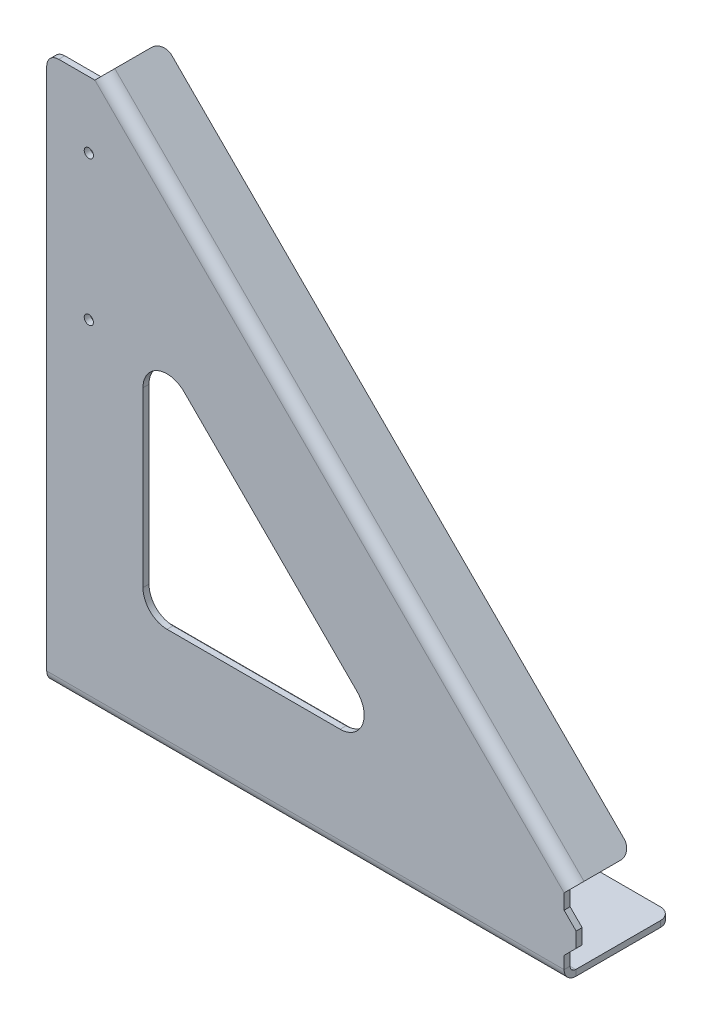
ISO-10303-21;
HEADER;
FILE_DESCRIPTION(('STEP AP214'),'2;1');
FILE_NAME('part.step','',(''),(''),'','','');
FILE_SCHEMA(('AUTOMOTIVE_DESIGN { 1 0 10303 214 1 1 1 1 }'));
ENDSEC;
DATA;
#1=APPLICATION_CONTEXT('core data for automotive mechanical design processes');
#2=APPLICATION_PROTOCOL_DEFINITION('international standard','automotive_design',2000,#1);
#3=PRODUCT_CONTEXT('',#1,'mechanical');
#4=PRODUCT('Part','Part','',(#3));
#5=PRODUCT_RELATED_PRODUCT_CATEGORY('part','',(#4));
#6=PRODUCT_DEFINITION_FORMATION('','',#4);
#7=PRODUCT_DEFINITION_CONTEXT('part definition',#1,'design');
#8=PRODUCT_DEFINITION('design','',#6,#7);
#9=PRODUCT_DEFINITION_SHAPE('','',#8);
#10=(LENGTH_UNIT() NAMED_UNIT(*) SI_UNIT(.MILLI.,.METRE.));
#11=(NAMED_UNIT(*) PLANE_ANGLE_UNIT() SI_UNIT($,.RADIAN.));
#12=(NAMED_UNIT(*) SI_UNIT($,.STERADIAN.) SOLID_ANGLE_UNIT());
#13=UNCERTAINTY_MEASURE_WITH_UNIT(LENGTH_MEASURE(1.E-05),#10,'distance_accuracy_value','');
#14=(GEOMETRIC_REPRESENTATION_CONTEXT(3) GLOBAL_UNCERTAINTY_ASSIGNED_CONTEXT((#13)) GLOBAL_UNIT_ASSIGNED_CONTEXT((#10,
#11,#12)) REPRESENTATION_CONTEXT('',''));
#15=CARTESIAN_POINT('',(0.,0.,0.));
#16=DIRECTION('',(0.,0.,1.));
#17=DIRECTION('',(1.,0.,0.));
#18=AXIS2_PLACEMENT_3D('',#15,#16,#17);
#19=CARTESIAN_POINT('',(273.05,0.,-3.175));
#20=DIRECTION('',(1.,0.,0.));
#21=DIRECTION('',(0.,0.,-1.));
#22=AXIS2_PLACEMENT_3D('',#19,#20,#21);
#23=PLANE('',#22);
#24=DIRECTION('',(0.,0.,1.));
#25=VECTOR('',#24,1.);
#26=CARTESIAN_POINT('',(273.05,33.3375,-24.7673344326175));
#27=LINE('',#26,#25);
#28=CARTESIAN_POINT('',(273.05,33.3375,-3.175));
#29=VERTEX_POINT('',#28);
#30=CARTESIAN_POINT('',(273.05,33.3375,0.));
#31=VERTEX_POINT('',#30);
#32=EDGE_CURVE('E300',#29,#31,#27,.T.);
#33=ORIENTED_EDGE('',*,*,#32,.F.);
#34=DIRECTION('',(0.,1.,0.));
#35=VECTOR('',#34,1.);
#36=CARTESIAN_POINT('',(273.05,0.,-3.175));
#37=LINE('',#36,#35);
#38=CARTESIAN_POINT('',(273.05,41.275,-3.17500000000294));
#39=VERTEX_POINT('',#38);
#40=EDGE_CURVE('E429',#29,#39,#37,.T.);
#41=ORIENTED_EDGE('',*,*,#40,.T.);
#42=DIRECTION('',(0.,0.,1.));
#43=VECTOR('',#42,1.);
#44=CARTESIAN_POINT('',(273.05,41.275,-3.175));
#45=LINE('',#44,#43);
#46=CARTESIAN_POINT('',(273.050000000001,41.2750000000008,-2.94122365351868E-12));
#47=VERTEX_POINT('',#46);
#48=EDGE_CURVE('E438',#39,#47,#45,.T.);
#49=ORIENTED_EDGE('',*,*,#48,.T.);
#50=DIRECTION('',(0.,1.,0.));
#51=VECTOR('',#50,1.);
#52=CARTESIAN_POINT('',(273.05,0.,0.));
#53=LINE('',#52,#51);
#54=EDGE_CURVE('E440',#31,#47,#53,.T.);
#55=ORIENTED_EDGE('',*,*,#54,.F.);
#56=EDGE_LOOP('',(#33,#41,#49,#55));
#57=FACE_BOUND('',#56,.T.);
#58=ADVANCED_FACE('F78',(#57),#23,.T.);
#59=CARTESIAN_POINT('',(0.,288.924999999997,-3.175));
#60=DIRECTION('',(-1.,0.,0.));
#61=DIRECTION('',(0.,-1.,0.));
#62=AXIS2_PLACEMENT_3D('',#59,#60,#61);
#63=PLANE('',#62);
#64=DIRECTION('',(0.,-1.,0.));
#65=VECTOR('',#64,1.);
#66=CARTESIAN_POINT('',(0.,288.924999999997,0.));
#67=LINE('',#66,#65);
#68=CARTESIAN_POINT('',(0.,282.574999999997,0.));
#69=VERTEX_POINT('',#68);
#70=CARTESIAN_POINT('',(0.,6.17499999999999,0.));
#71=VERTEX_POINT('',#70);
#72=EDGE_CURVE('E418',#69,#71,#67,.T.);
#73=ORIENTED_EDGE('',*,*,#72,.F.);
#74=DIRECTION('',(0.,0.,1.));
#75=VECTOR('',#74,1.);
#76=CARTESIAN_POINT('',(0.,282.574999999997,-3.175));
#77=LINE('',#76,#75);
#78=CARTESIAN_POINT('',(0.,282.574999999997,-3.175));
#79=VERTEX_POINT('',#78);
#80=EDGE_CURVE('E483',#69,#79,#77,.F.);
#81=ORIENTED_EDGE('',*,*,#80,.T.);
#82=DIRECTION('',(0.,-1.,0.));
#83=VECTOR('',#82,1.);
#84=CARTESIAN_POINT('',(0.,288.924999999997,-3.175));
#85=LINE('',#84,#83);
#86=CARTESIAN_POINT('',(0.,6.17499999999999,-3.175));
#87=VERTEX_POINT('',#86);
#88=EDGE_CURVE('E427',#79,#87,#85,.T.);
#89=ORIENTED_EDGE('',*,*,#88,.T.);
#90=DIRECTION('',(0.,0.,1.));
#91=VECTOR('',#90,1.);
#92=CARTESIAN_POINT('',(0.,6.17499999999999,-3.175));
#93=LINE('',#92,#91);
#94=EDGE_CURVE('E371',#87,#71,#93,.T.);
#95=ORIENTED_EDGE('',*,*,#94,.T.);
#96=EDGE_LOOP('',(#73,#81,#89,#95));
#97=FACE_BOUND('',#96,.T.);
#98=ADVANCED_FACE('F542',(#97),#63,.T.);
#99=CARTESIAN_POINT('',(0.,0.,-3.175));
#100=DIRECTION('',(0.,0.,1.));
#101=DIRECTION('',(1.,0.,0.));
#102=AXIS2_PLACEMENT_3D('',#99,#100,#101);
#103=PLANE('',#102);
#104=CARTESIAN_POINT('',(22.225,254.,-3.175));
#105=DIRECTION('',(0.,0.,-1.));
#106=DIRECTION('',(-1.,0.,0.));
#107=AXIS2_PLACEMENT_3D('',#104,#105,#106);
#108=CIRCLE('',#107,2.42569999999999);
#109=CARTESIAN_POINT('',(19.7993,254.,-3.175));
#110=VERTEX_POINT('',#109);
#111=EDGE_CURVE('E307',#110,#110,#108,.T.);
#112=ORIENTED_EDGE('',*,*,#111,.F.);
#113=EDGE_LOOP('',(#112));
#114=FACE_BOUND('',#113,.T.);
#115=CARTESIAN_POINT('',(22.225,177.8,-3.175));
#116=DIRECTION('',(0.,0.,-1.));
#117=DIRECTION('',(-1.,0.,0.));
#118=AXIS2_PLACEMENT_3D('',#115,#116,#117);
#119=CIRCLE('',#118,2.42569999999999);
#120=CARTESIAN_POINT('',(19.7993,177.8,-3.175));
#121=VERTEX_POINT('',#120);
#122=EDGE_CURVE('E313',#121,#121,#119,.T.);
#123=ORIENTED_EDGE('',*,*,#122,.F.);
#124=EDGE_LOOP('',(#123));
#125=FACE_BOUND('',#124,.T.);
#126=DIRECTION('',(-0.707106781186548,0.707106781186547,0.));
#127=VECTOR('',#126,1.);
#128=CARTESIAN_POINT('',(121.241475515724,121.241475515724,-3.175));
#129=LINE('',#128,#127);
#130=CARTESIAN_POINT('',(163.827694910379,78.6552561210691,-3.175));
#131=VERTEX_POINT('',#130);
#132=CARTESIAN_POINT('',(72.4802561210691,170.002694910379,-3.175));
#133=VERTEX_POINT('',#132);
#134=EDGE_CURVE('E328',#131,#133,#129,.T.);
#135=ORIENTED_EDGE('',*,*,#134,.T.);
#136=CARTESIAN_POINT('',(63.5,161.02243878931,-3.175));
#137=DIRECTION('',(0.,0.,1.));
#138=DIRECTION('',(1.,0.,0.));
#139=AXIS2_PLACEMENT_3D('',#136,#137,#138);
#140=CIRCLE('',#139,12.7);
#141=CARTESIAN_POINT('',(50.8,161.02243878931,-3.175));
#142=VERTEX_POINT('',#141);
#143=EDGE_CURVE('E468',#133,#142,#140,.T.);
#144=ORIENTED_EDGE('',*,*,#143,.T.);
#145=DIRECTION('',(0.,-1.,0.));
#146=VECTOR('',#145,1.);
#147=CARTESIAN_POINT('',(50.8,0.,-3.175));
#148=LINE('',#147,#146);
#149=CARTESIAN_POINT('',(50.8,69.675,-3.175));
#150=VERTEX_POINT('',#149);
#151=EDGE_CURVE('E331',#142,#150,#148,.T.);
#152=ORIENTED_EDGE('',*,*,#151,.T.);
#153=CARTESIAN_POINT('',(63.5,69.675,-3.175));
#154=DIRECTION('',(0.,0.,1.));
#155=DIRECTION('',(1.,0.,0.));
#156=AXIS2_PLACEMENT_3D('',#153,#154,#155);
#157=CIRCLE('',#156,12.7);
#158=CARTESIAN_POINT('',(63.5,56.975,-3.175));
#159=VERTEX_POINT('',#158);
#160=EDGE_CURVE('E472',#150,#159,#157,.T.);
#161=ORIENTED_EDGE('',*,*,#160,.T.);
#162=DIRECTION('',(1.,0.,0.));
#163=VECTOR('',#162,1.);
#164=CARTESIAN_POINT('',(0.,56.975,-3.175));
#165=LINE('',#164,#163);
#166=CARTESIAN_POINT('',(154.84743878931,56.975,-3.175));
#167=VERTEX_POINT('',#166);
#168=EDGE_CURVE('E334',#159,#167,#165,.T.);
#169=ORIENTED_EDGE('',*,*,#168,.T.);
#170=CARTESIAN_POINT('',(154.84743878931,69.675,-3.175));
#171=DIRECTION('',(0.,0.,1.));
#172=DIRECTION('',(1.,0.,0.));
#173=AXIS2_PLACEMENT_3D('',#170,#171,#172);
#174=CIRCLE('',#173,12.7);
#175=EDGE_CURVE('E476',#167,#131,#174,.T.);
#176=ORIENTED_EDGE('',*,*,#175,.T.);
#177=EDGE_LOOP('',(#135,#144,#152,#161,#169,#176));
#178=FACE_BOUND('',#177,.T.);
#179=ORIENTED_EDGE('',*,*,#88,.F.);
#180=CARTESIAN_POINT('',(6.35,282.574999999997,-3.175));
#181=DIRECTION('',(0.,0.,1.));
#182=DIRECTION('',(1.,0.,0.));
#183=AXIS2_PLACEMENT_3D('',#180,#181,#182);
#184=CIRCLE('',#183,6.35);
#185=CARTESIAN_POINT('',(6.35000000000002,288.924999999997,-3.175));
#186=VERTEX_POINT('',#185);
#187=EDGE_CURVE('E485',#79,#186,#184,.F.);
#188=ORIENTED_EDGE('',*,*,#187,.T.);
#189=DIRECTION('',(-1.,0.,0.));
#190=VECTOR('',#189,1.);
#191=CARTESIAN_POINT('',(25.4,288.924999999997,-3.175));
#192=LINE('',#191,#190);
#193=CARTESIAN_POINT('',(25.4000000000014,288.924999999999,-3.175000000001));
#194=VERTEX_POINT('',#193);
#195=EDGE_CURVE('E435',#194,#186,#192,.T.);
#196=ORIENTED_EDGE('',*,*,#195,.F.);
#197=DIRECTION('',(-0.707106781186551,0.707106781186543,0.));
#198=VECTOR('',#197,1.);
#199=CARTESIAN_POINT('',(273.05,41.275,-3.175));
#200=LINE('',#199,#198);
#201=EDGE_CURVE('E433',#39,#194,#200,.T.);
#202=ORIENTED_EDGE('',*,*,#201,.F.);
#203=ORIENTED_EDGE('',*,*,#40,.F.);
#204=DIRECTION('',(0.707106781186549,-0.707106781186546,0.));
#205=VECTOR('',#204,1.);
#206=CARTESIAN_POINT('',(273.05,33.3375,-3.175));
#207=LINE('',#206,#205);
#208=CARTESIAN_POINT('',(279.4,26.9875,-3.175));
#209=VERTEX_POINT('',#208);
#210=EDGE_CURVE('E296',#29,#209,#207,.T.);
#211=ORIENTED_EDGE('',*,*,#210,.T.);
#212=DIRECTION('',(0.,-1.,0.));
#213=VECTOR('',#212,1.);
#214=CARTESIAN_POINT('',(279.4,26.9875,-3.175));
#215=LINE('',#214,#213);
#216=CARTESIAN_POINT('',(279.4,19.05,-3.175));
#217=VERTEX_POINT('',#216);
#218=EDGE_CURVE('E303',#209,#217,#215,.T.);
#219=ORIENTED_EDGE('',*,*,#218,.T.);
#220=DIRECTION('',(-0.707106781186548,-0.707106781186547,0.));
#221=VECTOR('',#220,1.);
#222=CARTESIAN_POINT('',(279.4,19.05,-3.175));
#223=LINE('',#222,#221);
#224=CARTESIAN_POINT('',(273.05,12.7,-3.175));
#225=VERTEX_POINT('',#224);
#226=EDGE_CURVE('E273',#217,#225,#223,.T.);
#227=ORIENTED_EDGE('',*,*,#226,.T.);
#228=CARTESIAN_POINT('',(273.05,6.17499999999999,-3.175));
#229=VERTEX_POINT('',#228);
#230=EDGE_CURVE('E431',#229,#225,#37,.T.);
#231=ORIENTED_EDGE('',*,*,#230,.F.);
#232=DIRECTION('',(-1.,0.,0.));
#233=VECTOR('',#232,1.);
#234=CARTESIAN_POINT('',(0.,6.17499999999999,-3.175));
#235=LINE('',#234,#233);
#236=EDGE_CURVE('E377',#87,#229,#235,.F.);
#237=ORIENTED_EDGE('',*,*,#236,.F.);
#238=EDGE_LOOP('',(#179,#188,#196,#202,#203,#211,#219,#227,#231,#237));
#239=FACE_BOUND('',#238,.T.);
#240=ADVANCED_FACE('F547',(#114,#125,#178,#239),#103,.F.);
#241=CARTESIAN_POINT('',(0.,0.,0.));
#242=DIRECTION('',(0.,0.,1.));
#243=DIRECTION('',(1.,0.,0.));
#244=AXIS2_PLACEMENT_3D('',#241,#242,#243);
#245=PLANE('',#244);
#246=CARTESIAN_POINT('',(22.225,254.,0.));
#247=DIRECTION('',(0.,0.,-1.));
#248=DIRECTION('',(-1.,0.,0.));
#249=AXIS2_PLACEMENT_3D('',#246,#247,#248);
#250=CIRCLE('',#249,2.4257);
#251=CARTESIAN_POINT('',(19.7993,254.,0.));
#252=VERTEX_POINT('',#251);
#253=EDGE_CURVE('E310',#252,#252,#250,.T.);
#254=ORIENTED_EDGE('',*,*,#253,.T.);
#255=EDGE_LOOP('',(#254));
#256=FACE_BOUND('',#255,.T.);
#257=CARTESIAN_POINT('',(22.225,177.8,0.));
#258=DIRECTION('',(0.,0.,-1.));
#259=DIRECTION('',(-1.,0.,0.));
#260=AXIS2_PLACEMENT_3D('',#257,#258,#259);
#261=CIRCLE('',#260,2.4257);
#262=CARTESIAN_POINT('',(19.7993,177.8,0.));
#263=VERTEX_POINT('',#262);
#264=EDGE_CURVE('E316',#263,#263,#261,.T.);
#265=ORIENTED_EDGE('',*,*,#264,.T.);
#266=EDGE_LOOP('',(#265));
#267=FACE_BOUND('',#266,.T.);
#268=DIRECTION('',(1.,0.,0.));
#269=VECTOR('',#268,1.);
#270=CARTESIAN_POINT('',(185.507951031448,56.975,0.));
#271=LINE('',#270,#269);
#272=CARTESIAN_POINT('',(63.5,56.975,0.));
#273=VERTEX_POINT('',#272);
#274=CARTESIAN_POINT('',(154.84743878931,56.975,0.));
#275=VERTEX_POINT('',#274);
#276=EDGE_CURVE('E319',#273,#275,#271,.T.);
#277=ORIENTED_EDGE('',*,*,#276,.F.);
#278=CARTESIAN_POINT('',(63.5,69.675,0.));
#279=DIRECTION('',(0.,0.,1.));
#280=DIRECTION('',(1.,0.,0.));
#281=AXIS2_PLACEMENT_3D('',#278,#279,#280);
#282=CIRCLE('',#281,12.7);
#283=CARTESIAN_POINT('',(50.8,69.675,0.));
#284=VERTEX_POINT('',#283);
#285=EDGE_CURVE('E470',#273,#284,#282,.F.);
#286=ORIENTED_EDGE('',*,*,#285,.T.);
#287=DIRECTION('',(0.,-1.,0.));
#288=VECTOR('',#287,1.);
#289=CARTESIAN_POINT('',(50.8,191.682951031448,0.));
#290=LINE('',#289,#288);
#291=CARTESIAN_POINT('',(50.8,161.02243878931,0.));
#292=VERTEX_POINT('',#291);
#293=EDGE_CURVE('E325',#292,#284,#290,.T.);
#294=ORIENTED_EDGE('',*,*,#293,.F.);
#295=CARTESIAN_POINT('',(63.5,161.02243878931,0.));
#296=DIRECTION('',(0.,0.,1.));
#297=DIRECTION('',(1.,0.,0.));
#298=AXIS2_PLACEMENT_3D('',#295,#296,#297);
#299=CIRCLE('',#298,12.7);
#300=CARTESIAN_POINT('',(72.4802561210691,170.002694910379,0.));
#301=VERTEX_POINT('',#300);
#302=EDGE_CURVE('E466',#292,#301,#299,.F.);
#303=ORIENTED_EDGE('',*,*,#302,.T.);
#304=DIRECTION('',(-0.707106781186548,0.707106781186547,0.));
#305=VECTOR('',#304,1.);
#306=CARTESIAN_POINT('',(50.8,191.682951031448,0.));
#307=LINE('',#306,#305);
#308=CARTESIAN_POINT('',(163.827694910379,78.6552561210691,0.));
#309=VERTEX_POINT('',#308);
#310=EDGE_CURVE('E322',#309,#301,#307,.T.);
#311=ORIENTED_EDGE('',*,*,#310,.F.);
#312=CARTESIAN_POINT('',(154.84743878931,69.675,0.));
#313=DIRECTION('',(0.,0.,1.));
#314=DIRECTION('',(1.,0.,0.));
#315=AXIS2_PLACEMENT_3D('',#312,#313,#314);
#316=CIRCLE('',#315,12.7);
#317=EDGE_CURVE('E474',#309,#275,#316,.F.);
#318=ORIENTED_EDGE('',*,*,#317,.T.);
#319=EDGE_LOOP('',(#277,#286,#294,#303,#311,#318));
#320=FACE_BOUND('',#319,.T.);
#321=DIRECTION('',(-1.,0.,0.));
#322=VECTOR('',#321,1.);
#323=CARTESIAN_POINT('',(25.4,288.924999999997,0.));
#324=LINE('',#323,#322);
#325=CARTESIAN_POINT('',(25.4,288.924999999997,0.));
#326=VERTEX_POINT('',#325);
#327=CARTESIAN_POINT('',(6.35000000000002,288.924999999997,0.));
#328=VERTEX_POINT('',#327);
#329=EDGE_CURVE('E430',#326,#328,#324,.T.);
#330=ORIENTED_EDGE('',*,*,#329,.T.);
#331=CARTESIAN_POINT('',(6.35,282.574999999997,0.));
#332=DIRECTION('',(0.,0.,1.));
#333=DIRECTION('',(1.,0.,0.));
#334=AXIS2_PLACEMENT_3D('',#331,#332,#333);
#335=CIRCLE('',#334,6.35);
#336=EDGE_CURVE('E481',#328,#69,#335,.T.);
#337=ORIENTED_EDGE('',*,*,#336,.T.);
#338=ORIENTED_EDGE('',*,*,#72,.T.);
#339=DIRECTION('',(-1.,0.,0.));
#340=VECTOR('',#339,1.);
#341=CARTESIAN_POINT('',(0.,6.17499999999999,0.));
#342=LINE('',#341,#340);
#343=CARTESIAN_POINT('',(273.05,6.17499999999999,0.));
#344=VERTEX_POINT('',#343);
#345=EDGE_CURVE('E365',#71,#344,#342,.F.);
#346=ORIENTED_EDGE('',*,*,#345,.T.);
#347=CARTESIAN_POINT('',(273.05,12.7,0.));
#348=VERTEX_POINT('',#347);
#349=EDGE_CURVE('E293',#344,#348,#53,.T.);
#350=ORIENTED_EDGE('',*,*,#349,.T.);
#351=DIRECTION('',(0.707106781186548,0.707106781186547,0.));
#352=VECTOR('',#351,1.);
#353=CARTESIAN_POINT('',(279.4,19.05,0.));
#354=LINE('',#353,#352);
#355=CARTESIAN_POINT('',(279.4,19.05,0.));
#356=VERTEX_POINT('',#355);
#357=EDGE_CURVE('E271',#348,#356,#354,.T.);
#358=ORIENTED_EDGE('',*,*,#357,.T.);
#359=DIRECTION('',(0.,1.,0.));
#360=VECTOR('',#359,1.);
#361=CARTESIAN_POINT('',(279.4,26.9875,0.));
#362=LINE('',#361,#360);
#363=CARTESIAN_POINT('',(279.4,26.9875,0.));
#364=VERTEX_POINT('',#363);
#365=EDGE_CURVE('E280',#356,#364,#362,.T.);
#366=ORIENTED_EDGE('',*,*,#365,.T.);
#367=DIRECTION('',(-0.707106781186549,0.707106781186546,0.));
#368=VECTOR('',#367,1.);
#369=CARTESIAN_POINT('',(273.05,33.3375,0.));
#370=LINE('',#369,#368);
#371=EDGE_CURVE('E286',#364,#31,#370,.T.);
#372=ORIENTED_EDGE('',*,*,#371,.T.);
#373=ORIENTED_EDGE('',*,*,#54,.T.);
#374=DIRECTION('',(-0.707106781186551,0.707106781186543,0.));
#375=VECTOR('',#374,1.);
#376=CARTESIAN_POINT('',(273.05,41.275,0.));
#377=LINE('',#376,#375);
#378=EDGE_CURVE('E442',#47,#326,#377,.T.);
#379=ORIENTED_EDGE('',*,*,#378,.T.);
#380=EDGE_LOOP('',(#330,#337,#338,#346,#350,#358,#366,#372,#373,#379));
#381=FACE_BOUND('',#380,.T.);
#382=ADVANCED_FACE('F290',(#256,#267,#320,#381),#245,.T.);
#383=CARTESIAN_POINT('',(25.4,288.924999999997,-3.175));
#384=DIRECTION('',(0.,1.,0.));
#385=DIRECTION('',(-1.,0.,0.));
#386=AXIS2_PLACEMENT_3D('',#383,#384,#385);
#387=PLANE('',#386);
#388=ORIENTED_EDGE('',*,*,#195,.T.);
#389=DIRECTION('',(0.,0.,1.));
#390=VECTOR('',#389,1.);
#391=CARTESIAN_POINT('',(6.35000000000002,288.924999999997,-3.175));
#392=LINE('',#391,#390);
#393=EDGE_CURVE('E478',#186,#328,#392,.T.);
#394=ORIENTED_EDGE('',*,*,#393,.T.);
#395=ORIENTED_EDGE('',*,*,#329,.F.);
#396=DIRECTION('',(0.,0.,1.));
#397=VECTOR('',#396,1.);
#398=CARTESIAN_POINT('',(25.4,288.924999999997,-3.175));
#399=LINE('',#398,#397);
#400=EDGE_CURVE('E446',#194,#326,#399,.T.);
#401=ORIENTED_EDGE('',*,*,#400,.F.);
#402=EDGE_LOOP('',(#388,#394,#395,#401));
#403=FACE_BOUND('',#402,.T.);
#404=ADVANCED_FACE('F555',(#403),#387,.T.);
#405=DIRECTION('',(0.,0.,1.));
#406=VECTOR('',#405,1.);
#407=CARTESIAN_POINT('',(273.05,12.7,-24.7673344326175));
#408=LINE('',#407,#406);
#409=EDGE_CURVE('E277',#225,#348,#408,.T.);
#410=ORIENTED_EDGE('',*,*,#409,.T.);
#411=ORIENTED_EDGE('',*,*,#349,.F.);
#412=DIRECTION('',(0.,0.,1.));
#413=VECTOR('',#412,1.);
#414=CARTESIAN_POINT('',(273.05,6.17499999999999,-3.175));
#415=LINE('',#414,#413);
#416=EDGE_CURVE('E381',#229,#344,#415,.T.);
#417=ORIENTED_EDGE('',*,*,#416,.F.);
#418=ORIENTED_EDGE('',*,*,#230,.T.);
#419=EDGE_LOOP('',(#410,#411,#417,#418));
#420=FACE_BOUND('',#419,.T.);
#421=ADVANCED_FACE('F615',(#420),#23,.T.);
#422=CARTESIAN_POINT('',(25.4000000000007,288.924999999998,-6.17500000000002));
#423=DIRECTION('',(-0.707106781186548,0.707106781186548,0.));
#424=DIRECTION('',(-0.707106781186548,-0.707106781186548,0.));
#425=AXIS2_PLACEMENT_3D('',#422,#423,#424);
#426=PLANE('',#425);
#427=DIRECTION('',(0.707106781186544,0.707106781186551,0.));
#428=VECTOR('',#427,1.);
#429=CARTESIAN_POINT('',(29.7663843738269,293.291384373824,-6.175));
#430=LINE('',#429,#428);
#431=CARTESIAN_POINT('',(27.5213203435597,291.046320343557,-6.17500000000001));
#432=VERTEX_POINT('',#431);
#433=CARTESIAN_POINT('',(29.7663843738269,293.291384373824,-6.175));
#434=VERTEX_POINT('',#433);
#435=EDGE_CURVE('E384',#432,#434,#430,.T.);
#436=ORIENTED_EDGE('',*,*,#435,.F.);
#437=CARTESIAN_POINT('',(25.4000000000007,288.924999999998,-6.17500000000002));
#438=DIRECTION('',(0.707106781186548,-0.707106781186548,0.));
#439=DIRECTION('',(0.707106781186548,0.707106781186548,0.));
#440=AXIS2_PLACEMENT_3D('',#437,#438,#439);
#441=CIRCLE('',#440,2.99999999999902);
#442=EDGE_CURVE('E422',#194,#432,#441,.F.);
#443=ORIENTED_EDGE('',*,*,#442,.F.);
#444=ORIENTED_EDGE('',*,*,#400,.T.);
#445=CARTESIAN_POINT('',(25.4000000000007,288.924999999998,-6.17500000000002));
#446=DIRECTION('',(0.707106781186548,-0.707106781186548,0.));
#447=DIRECTION('',(0.707106781186548,0.707106781186548,0.));
#448=AXIS2_PLACEMENT_3D('',#445,#446,#447);
#449=CIRCLE('',#448,6.17499999999902);
#450=EDGE_CURVE('E415',#326,#434,#449,.F.);
#451=ORIENTED_EDGE('',*,*,#450,.T.);
#452=EDGE_LOOP('',(#436,#443,#444,#451));
#453=FACE_BOUND('',#452,.T.);
#454=ADVANCED_FACE('F575',(#453),#426,.T.);
#455=CARTESIAN_POINT('',(273.049999999999,41.2749999999993,-6.17500000000197));
#456=DIRECTION('',(-0.707106781186548,0.707106781186548,0.));
#457=DIRECTION('',(-0.707106781186548,-0.707106781186548,0.));
#458=AXIS2_PLACEMENT_3D('',#455,#456,#457);
#459=PLANE('',#458);
#460=CARTESIAN_POINT('',(273.049999999999,41.2749999999993,-6.17500000000197));
#461=DIRECTION('',(0.707106781186548,-0.707106781186548,0.));
#462=DIRECTION('',(0.707106781186548,0.707106781186548,0.));
#463=AXIS2_PLACEMENT_3D('',#460,#461,#462);
#464=CIRCLE('',#463,2.99999999999902);
#465=CARTESIAN_POINT('',(275.171320343558,43.3963203435583,-6.17500000000196));
#466=VERTEX_POINT('',#465);
#467=EDGE_CURVE('E389',#466,#39,#464,.T.);
#468=ORIENTED_EDGE('',*,*,#467,.F.);
#469=DIRECTION('',(0.707106781186544,0.707106781186551,0.));
#470=VECTOR('',#469,1.);
#471=CARTESIAN_POINT('',(275.17132034356,43.3963203435597,-6.17500000000196));
#472=LINE('',#471,#470);
#473=CARTESIAN_POINT('',(277.416384373827,45.641384373827,-6.17500000000195));
#474=VERTEX_POINT('',#473);
#475=EDGE_CURVE('E407',#466,#474,#472,.T.);
#476=ORIENTED_EDGE('',*,*,#475,.T.);
#477=CARTESIAN_POINT('',(273.049999999999,41.2749999999993,-6.17500000000197));
#478=DIRECTION('',(0.707106781186548,-0.707106781186548,0.));
#479=DIRECTION('',(0.707106781186548,0.707106781186548,0.));
#480=AXIS2_PLACEMENT_3D('',#477,#478,#479);
#481=CIRCLE('',#480,6.17499999999902);
#482=EDGE_CURVE('E419',#474,#47,#481,.T.);
#483=ORIENTED_EDGE('',*,*,#482,.T.);
#484=ORIENTED_EDGE('',*,*,#48,.F.);
#485=EDGE_LOOP('',(#468,#476,#483,#484));
#486=FACE_BOUND('',#485,.T.);
#487=ADVANCED_FACE('F564',(#486),#459,.F.);
#488=CARTESIAN_POINT('',(273.049999999999,41.2749999999993,-6.17500000000197));
#489=DIRECTION('',(0.707106781186548,-0.707106781186548,0.));
#490=DIRECTION('',(0.707106781186548,0.707106781186548,0.));
#491=AXIS2_PLACEMENT_3D('',#488,#489,#490);
#492=CYLINDRICAL_SURFACE('',#491,6.17499999999902);
#493=ORIENTED_EDGE('',*,*,#378,.F.);
#494=ORIENTED_EDGE('',*,*,#482,.F.);
#495=DIRECTION('',(0.707106781186552,-0.707106781186544,0.));
#496=VECTOR('',#495,1.);
#497=CARTESIAN_POINT('',(161.528884373825,161.528884373827,-6.17500000000104));
#498=LINE('',#497,#496);
#499=EDGE_CURVE('E404',#434,#474,#498,.T.);
#500=ORIENTED_EDGE('',*,*,#499,.F.);
#501=ORIENTED_EDGE('',*,*,#450,.F.);
#502=EDGE_LOOP('',(#493,#494,#500,#501));
#503=FACE_BOUND('',#502,.T.);
#504=ADVANCED_FACE('F560',(#503),#492,.T.);
#505=CARTESIAN_POINT('',(273.049999999999,41.2749999999993,-6.17500000000197));
#506=DIRECTION('',(0.707106781186548,-0.707106781186548,0.));
#507=DIRECTION('',(0.707106781186548,0.707106781186548,0.));
#508=AXIS2_PLACEMENT_3D('',#505,#506,#507);
#509=CYLINDRICAL_SURFACE('',#508,2.99999999999902);
#510=ORIENTED_EDGE('',*,*,#201,.T.);
#511=ORIENTED_EDGE('',*,*,#442,.T.);
#512=DIRECTION('',(-0.707106781186552,0.707106781186544,0.));
#513=VECTOR('',#512,1.);
#514=CARTESIAN_POINT('',(27.5213203435596,291.046320343557,-6.17500000000001));
#515=LINE('',#514,#513);
#516=EDGE_CURVE('E410',#432,#466,#515,.F.);
#517=ORIENTED_EDGE('',*,*,#516,.T.);
#518=ORIENTED_EDGE('',*,*,#467,.T.);
#519=EDGE_LOOP('',(#510,#511,#517,#518));
#520=FACE_BOUND('',#519,.T.);
#521=ADVANCED_FACE('F572',(#520),#509,.F.);
#522=CARTESIAN_POINT('',(277.416384373827,45.641384373827,-3.17499999999999));
#523=DIRECTION('',(0.707106781186551,-0.707106781186544,0.));
#524=DIRECTION('',(0.707106781186544,0.707106781186551,0.));
#525=AXIS2_PLACEMENT_3D('',#522,#523,#524);
#526=PLANE('',#525);
#527=DIRECTION('',(0.,0.,-1.));
#528=VECTOR('',#527,1.);
#529=CARTESIAN_POINT('',(275.17132034356,43.3963203435597,6.30668357044013E-13));
#530=LINE('',#529,#528);
#531=CARTESIAN_POINT('',(275.17132034356,43.3963203435597,-25.4));
#532=VERTEX_POINT('',#531);
#533=EDGE_CURVE('E396',#532,#466,#530,.F.);
#534=ORIENTED_EDGE('',*,*,#533,.F.);
#535=DIRECTION('',(-0.707106781186544,-0.707106781186551,0.));
#536=VECTOR('',#535,1.);
#537=CARTESIAN_POINT('',(277.416384373827,45.641384373827,-25.4));
#538=LINE('',#537,#536);
#539=CARTESIAN_POINT('',(277.416384373827,45.641384373827,-25.4));
#540=VERTEX_POINT('',#539);
#541=EDGE_CURVE('E13',#532,#540,#538,.F.);
#542=ORIENTED_EDGE('',*,*,#541,.T.);
#543=DIRECTION('',(0.,0.,1.));
#544=VECTOR('',#543,1.);
#545=CARTESIAN_POINT('',(277.416384373827,45.641384373827,-3.17499999999999));
#546=LINE('',#545,#544);
#547=EDGE_CURVE('E387',#540,#474,#546,.T.);
#548=ORIENTED_EDGE('',*,*,#547,.T.);
#549=ORIENTED_EDGE('',*,*,#475,.F.);
#550=EDGE_LOOP('',(#534,#542,#548,#549));
#551=FACE_BOUND('',#550,.T.);
#552=ADVANCED_FACE('F594',(#551),#526,.T.);
#553=CARTESIAN_POINT('',(29.766384373827,293.291384373824,-31.75));
#554=DIRECTION('',(-0.707106781186551,0.707106781186544,0.));
#555=DIRECTION('',(-0.707106781186544,-0.707106781186551,0.));
#556=AXIS2_PLACEMENT_3D('',#553,#554,#555);
#557=PLANE('',#556);
#558=DIRECTION('',(0.,0.,-1.));
#559=VECTOR('',#558,1.);
#560=CARTESIAN_POINT('',(29.766384373827,293.291384373824,-31.75));
#561=LINE('',#560,#559);
#562=CARTESIAN_POINT('',(29.766384373827,293.291384373824,-25.4));
#563=VERTEX_POINT('',#562);
#564=EDGE_CURVE('E393',#434,#563,#561,.T.);
#565=ORIENTED_EDGE('',*,*,#564,.T.);
#566=DIRECTION('',(-0.707106781186544,-0.707106781186551,0.));
#567=VECTOR('',#566,1.);
#568=CARTESIAN_POINT('',(29.766384373827,293.291384373824,-25.4));
#569=LINE('',#568,#567);
#570=CARTESIAN_POINT('',(27.5213203435597,291.046320343557,-25.4));
#571=VERTEX_POINT('',#570);
#572=EDGE_CURVE('E487',#563,#571,#569,.T.);
#573=ORIENTED_EDGE('',*,*,#572,.T.);
#574=DIRECTION('',(0.,0.,1.));
#575=VECTOR('',#574,1.);
#576=CARTESIAN_POINT('',(27.5213203435596,291.046320343557,5.58966453370301E-13));
#577=LINE('',#576,#575);
#578=EDGE_CURVE('E401',#432,#571,#577,.F.);
#579=ORIENTED_EDGE('',*,*,#578,.F.);
#580=ORIENTED_EDGE('',*,*,#435,.T.);
#581=EDGE_LOOP('',(#565,#573,#579,#580));
#582=FACE_BOUND('',#581,.T.);
#583=ADVANCED_FACE('F579',(#582),#557,.T.);
#584=CARTESIAN_POINT('',(161.528884373825,161.528884373827,6.98035949737641E-13));
#585=DIRECTION('',(0.707106781186544,0.707106781186552,0.));
#586=DIRECTION('',(-0.707106781186552,0.707106781186544,0.));
#587=AXIS2_PLACEMENT_3D('',#584,#585,#586);
#588=PLANE('',#587);
#589=DIRECTION('',(0.707106781186552,-0.707106781186544,0.));
#590=VECTOR('',#589,1.);
#591=CARTESIAN_POINT('',(277.416384373827,45.641384373827,-31.75));
#592=LINE('',#591,#590);
#593=CARTESIAN_POINT('',(34.2565124343615,288.80125631329,-31.75));
#594=VERTEX_POINT('',#593);
#595=CARTESIAN_POINT('',(272.926256313292,50.1315124343616,-31.75));
#596=VERTEX_POINT('',#595);
#597=EDGE_CURVE('E390',#594,#596,#592,.T.);
#598=ORIENTED_EDGE('',*,*,#597,.F.);
#599=CARTESIAN_POINT('',(34.2565124343616,288.80125631329,-25.4));
#600=DIRECTION('',(0.707106781186544,0.707106781186552,0.));
#601=DIRECTION('',(-0.707106781186552,0.707106781186544,0.));
#602=AXIS2_PLACEMENT_3D('',#599,#600,#601);
#603=CIRCLE('',#602,6.35);
#604=EDGE_CURVE('E501',#594,#563,#603,.T.);
#605=ORIENTED_EDGE('',*,*,#604,.T.);
#606=ORIENTED_EDGE('',*,*,#564,.F.);
#607=ORIENTED_EDGE('',*,*,#499,.T.);
#608=ORIENTED_EDGE('',*,*,#547,.F.);
#609=CARTESIAN_POINT('',(272.926256313292,50.1315124343616,-25.4));
#610=DIRECTION('',(0.707106781186544,0.707106781186552,0.));
#611=DIRECTION('',(-0.707106781186552,0.707106781186544,0.));
#612=AXIS2_PLACEMENT_3D('',#609,#610,#611);
#613=CIRCLE('',#612,6.35);
#614=EDGE_CURVE('E499',#540,#596,#613,.T.);
#615=ORIENTED_EDGE('',*,*,#614,.T.);
#616=EDGE_LOOP('',(#598,#605,#606,#607,#608,#615));
#617=FACE_BOUND('',#616,.T.);
#618=ADVANCED_FACE('F583',(#617),#588,.T.);
#619=CARTESIAN_POINT('',(159.283820343558,159.28382034356,6.86950496486814E-13));
#620=DIRECTION('',(0.707106781186544,0.707106781186552,0.));
#621=DIRECTION('',(-0.707106781186552,0.707106781186544,0.));
#622=AXIS2_PLACEMENT_3D('',#619,#620,#621);
#623=PLANE('',#622);
#624=ORIENTED_EDGE('',*,*,#578,.T.);
#625=CARTESIAN_POINT('',(32.0114484040943,286.556192283022,-25.4));
#626=DIRECTION('',(0.707106781186544,0.707106781186552,0.));
#627=DIRECTION('',(-0.707106781186552,0.707106781186544,0.));
#628=AXIS2_PLACEMENT_3D('',#625,#626,#627);
#629=CIRCLE('',#628,6.35);
#630=CARTESIAN_POINT('',(32.0114484040943,286.556192283022,-31.75));
#631=VERTEX_POINT('',#630);
#632=EDGE_CURVE('E492',#571,#631,#629,.F.);
#633=ORIENTED_EDGE('',*,*,#632,.T.);
#634=DIRECTION('',(-0.707106781186552,0.707106781186544,0.));
#635=VECTOR('',#634,1.);
#636=CARTESIAN_POINT('',(159.283820343558,159.28382034356,-31.75));
#637=LINE('',#636,#635);
#638=CARTESIAN_POINT('',(270.681192283025,47.8864484040943,-31.75));
#639=VERTEX_POINT('',#638);
#640=EDGE_CURVE('E398',#631,#639,#637,.F.);
#641=ORIENTED_EDGE('',*,*,#640,.T.);
#642=CARTESIAN_POINT('',(270.681192283025,47.8864484040943,-25.4));
#643=DIRECTION('',(0.707106781186544,0.707106781186552,0.));
#644=DIRECTION('',(-0.707106781186552,0.707106781186544,0.));
#645=AXIS2_PLACEMENT_3D('',#642,#643,#644);
#646=CIRCLE('',#645,6.35);
#647=EDGE_CURVE('E490',#639,#532,#646,.F.);
#648=ORIENTED_EDGE('',*,*,#647,.T.);
#649=ORIENTED_EDGE('',*,*,#533,.T.);
#650=ORIENTED_EDGE('',*,*,#516,.F.);
#651=EDGE_LOOP('',(#624,#633,#641,#648,#649,#650));
#652=FACE_BOUND('',#651,.T.);
#653=ADVANCED_FACE('F590',(#652),#623,.F.);
#654=CARTESIAN_POINT('',(277.416384373827,45.641384373827,-31.75));
#655=DIRECTION('',(0.,0.,-1.));
#656=DIRECTION('',(0.,1.,0.));
#657=AXIS2_PLACEMENT_3D('',#654,#655,#656);
#658=PLANE('',#657);
#659=ORIENTED_EDGE('',*,*,#640,.F.);
#660=DIRECTION('',(-0.707106781186544,-0.707106781186551,0.));
#661=VECTOR('',#660,1.);
#662=CARTESIAN_POINT('',(34.2565124343616,288.80125631329,-31.75));
#663=LINE('',#662,#661);
#664=EDGE_CURVE('E497',#631,#594,#663,.F.);
#665=ORIENTED_EDGE('',*,*,#664,.T.);
#666=ORIENTED_EDGE('',*,*,#597,.T.);
#667=DIRECTION('',(-0.707106781186544,-0.707106781186551,0.));
#668=VECTOR('',#667,1.);
#669=CARTESIAN_POINT('',(272.926256313292,50.1315124343616,-31.75));
#670=LINE('',#669,#668);
#671=EDGE_CURVE('E494',#596,#639,#670,.T.);
#672=ORIENTED_EDGE('',*,*,#671,.T.);
#673=EDGE_LOOP('',(#659,#665,#666,#672));
#674=FACE_BOUND('',#673,.T.);
#675=ADVANCED_FACE('F600',(#674),#658,.T.);
#676=CARTESIAN_POINT('',(273.05,6.17499999999999,-6.175));
#677=DIRECTION('',(1.,0.,0.));
#678=DIRECTION('',(0.,0.,-1.));
#679=AXIS2_PLACEMENT_3D('',#676,#677,#678);
#680=PLANE('',#679);
#681=DIRECTION('',(0.,-1.,0.));
#682=VECTOR('',#681,1.);
#683=CARTESIAN_POINT('',(273.05,0.,-6.17499999999998));
#684=LINE('',#683,#682);
#685=CARTESIAN_POINT('',(273.05,3.17499999999999,-6.17499999999999));
#686=VERTEX_POINT('',#685);
#687=CARTESIAN_POINT('',(273.05,0.,-6.17499999999998));
#688=VERTEX_POINT('',#687);
#689=EDGE_CURVE('E337',#686,#688,#684,.T.);
#690=ORIENTED_EDGE('',*,*,#689,.F.);
#691=CARTESIAN_POINT('',(273.05,6.17499999999999,-6.175));
#692=DIRECTION('',(-1.,0.,0.));
#693=DIRECTION('',(0.,0.,1.));
#694=AXIS2_PLACEMENT_3D('',#691,#692,#693);
#695=CIRCLE('',#694,3.);
#696=EDGE_CURVE('E374',#229,#686,#695,.F.);
#697=ORIENTED_EDGE('',*,*,#696,.F.);
#698=ORIENTED_EDGE('',*,*,#416,.T.);
#699=CARTESIAN_POINT('',(273.05,6.17499999999999,-6.175));
#700=DIRECTION('',(-1.,0.,0.));
#701=DIRECTION('',(0.,0.,1.));
#702=AXIS2_PLACEMENT_3D('',#699,#700,#701);
#703=CIRCLE('',#702,6.175);
#704=EDGE_CURVE('E367',#344,#688,#703,.F.);
#705=ORIENTED_EDGE('',*,*,#704,.T.);
#706=EDGE_LOOP('',(#690,#697,#698,#705));
#707=FACE_BOUND('',#706,.T.);
#708=ADVANCED_FACE('F602',(#707),#680,.T.);
#709=CARTESIAN_POINT('',(0.,6.17499999999999,-6.175));
#710=DIRECTION('',(1.,0.,0.));
#711=DIRECTION('',(0.,0.,-1.));
#712=AXIS2_PLACEMENT_3D('',#709,#710,#711);
#713=PLANE('',#712);
#714=CARTESIAN_POINT('',(0.,6.17499999999999,-6.175));
#715=DIRECTION('',(-1.,0.,0.));
#716=DIRECTION('',(0.,0.,1.));
#717=AXIS2_PLACEMENT_3D('',#714,#715,#716);
#718=CIRCLE('',#717,3.);
#719=CARTESIAN_POINT('',(0.,3.17499999999999,-6.17499999999999));
#720=VERTEX_POINT('',#719);
#721=EDGE_CURVE('E340',#720,#87,#718,.T.);
#722=ORIENTED_EDGE('',*,*,#721,.F.);
#723=DIRECTION('',(0.,-1.,0.));
#724=VECTOR('',#723,1.);
#725=CARTESIAN_POINT('',(0.,3.17499999999999,-6.17499999999999));
#726=LINE('',#725,#724);
#727=CARTESIAN_POINT('',(0.,0.,-6.17499999999998));
#728=VERTEX_POINT('',#727);
#729=EDGE_CURVE('E357',#720,#728,#726,.T.);
#730=ORIENTED_EDGE('',*,*,#729,.T.);
#731=CARTESIAN_POINT('',(0.,6.17499999999999,-6.175));
#732=DIRECTION('',(-1.,0.,0.));
#733=DIRECTION('',(0.,0.,1.));
#734=AXIS2_PLACEMENT_3D('',#731,#732,#733);
#735=CIRCLE('',#734,6.175);
#736=EDGE_CURVE('E368',#728,#71,#735,.T.);
#737=ORIENTED_EDGE('',*,*,#736,.T.);
#738=ORIENTED_EDGE('',*,*,#94,.F.);
#739=EDGE_LOOP('',(#722,#730,#737,#738));
#740=FACE_BOUND('',#739,.T.);
#741=ADVANCED_FACE('F533',(#740),#713,.F.);
#742=CARTESIAN_POINT('',(0.,6.17499999999999,-6.175));
#743=DIRECTION('',(-1.,0.,0.));
#744=DIRECTION('',(0.,-1.,0.));
#745=AXIS2_PLACEMENT_3D('',#742,#743,#744);
#746=CYLINDRICAL_SURFACE('',#745,6.175);
#747=ORIENTED_EDGE('',*,*,#345,.F.);
#748=ORIENTED_EDGE('',*,*,#736,.F.);
#749=DIRECTION('',(-1.,0.,0.));
#750=VECTOR('',#749,1.);
#751=CARTESIAN_POINT('',(0.,0.,-6.17499999999998));
#752=LINE('',#751,#750);
#753=EDGE_CURVE('E354',#688,#728,#752,.T.);
#754=ORIENTED_EDGE('',*,*,#753,.F.);
#755=ORIENTED_EDGE('',*,*,#704,.F.);
#756=EDGE_LOOP('',(#747,#748,#754,#755));
#757=FACE_BOUND('',#756,.T.);
#758=ADVANCED_FACE('F539',(#757),#746,.T.);
#759=CARTESIAN_POINT('',(0.,6.17499999999999,-6.175));
#760=DIRECTION('',(-1.,0.,0.));
#761=DIRECTION('',(0.,-1.,0.));
#762=AXIS2_PLACEMENT_3D('',#759,#760,#761);
#763=CYLINDRICAL_SURFACE('',#762,3.);
#764=ORIENTED_EDGE('',*,*,#236,.T.);
#765=ORIENTED_EDGE('',*,*,#696,.T.);
#766=DIRECTION('',(1.,0.,0.));
#767=VECTOR('',#766,1.);
#768=CARTESIAN_POINT('',(273.05,3.17499999999999,-6.17499999999999));
#769=LINE('',#768,#767);
#770=EDGE_CURVE('E360',#686,#720,#769,.F.);
#771=ORIENTED_EDGE('',*,*,#770,.T.);
#772=ORIENTED_EDGE('',*,*,#721,.T.);
#773=EDGE_LOOP('',(#764,#765,#771,#772));
#774=FACE_BOUND('',#773,.T.);
#775=ADVANCED_FACE('F527',(#774),#763,.F.);
#776=CARTESIAN_POINT('',(0.,0.,-3.17499999999999));
#777=DIRECTION('',(-1.,0.,0.));
#778=DIRECTION('',(0.,0.,1.));
#779=AXIS2_PLACEMENT_3D('',#776,#777,#778);
#780=PLANE('',#779);
#781=DIRECTION('',(0.,0.,-1.));
#782=VECTOR('',#781,1.);
#783=CARTESIAN_POINT('',(0.,3.17500000000001,0.));
#784=LINE('',#783,#782);
#785=CARTESIAN_POINT('',(0.,3.17499999999983,-50.8));
#786=VERTEX_POINT('',#785);
#787=EDGE_CURVE('E346',#786,#720,#784,.F.);
#788=ORIENTED_EDGE('',*,*,#787,.F.);
#789=DIRECTION('',(0.,1.,0.));
#790=VECTOR('',#789,1.);
#791=CARTESIAN_POINT('',(0.,-1.66281798762404E-13,-50.8));
#792=LINE('',#791,#790);
#793=CARTESIAN_POINT('',(0.,-1.66281798762404E-13,-50.8));
#794=VERTEX_POINT('',#793);
#795=EDGE_CURVE('E101',#786,#794,#792,.F.);
#796=ORIENTED_EDGE('',*,*,#795,.T.);
#797=DIRECTION('',(0.,0.,1.));
#798=VECTOR('',#797,1.);
#799=CARTESIAN_POINT('',(0.,0.,-3.17499999999999));
#800=LINE('',#799,#798);
#801=EDGE_CURVE('E338',#794,#728,#800,.T.);
#802=ORIENTED_EDGE('',*,*,#801,.T.);
#803=ORIENTED_EDGE('',*,*,#729,.F.);
#804=EDGE_LOOP('',(#788,#796,#802,#803));
#805=FACE_BOUND('',#804,.T.);
#806=ADVANCED_FACE('F534',(#805),#780,.T.);
#807=CARTESIAN_POINT('',(273.05,-1.88651178012478E-13,-57.15));
#808=DIRECTION('',(1.,0.,0.));
#809=DIRECTION('',(0.,0.,-1.));
#810=AXIS2_PLACEMENT_3D('',#807,#808,#809);
#811=PLANE('',#810);
#812=DIRECTION('',(0.,0.,-1.));
#813=VECTOR('',#812,1.);
#814=CARTESIAN_POINT('',(273.05,-1.88651178012478E-13,-57.15));
#815=LINE('',#814,#813);
#816=CARTESIAN_POINT('',(273.05,-1.66480271510824E-13,-50.8));
#817=VERTEX_POINT('',#816);
#818=EDGE_CURVE('E344',#688,#817,#815,.T.);
#819=ORIENTED_EDGE('',*,*,#818,.T.);
#820=DIRECTION('',(0.,1.,0.));
#821=VECTOR('',#820,1.);
#822=CARTESIAN_POINT('',(273.05,-1.66480271510824E-13,-50.8));
#823=LINE('',#822,#821);
#824=CARTESIAN_POINT('',(273.05,3.17499999999983,-50.8));
#825=VERTEX_POINT('',#824);
#826=EDGE_CURVE('E86',#817,#825,#823,.T.);
#827=ORIENTED_EDGE('',*,*,#826,.T.);
#828=DIRECTION('',(0.,0.,1.));
#829=VECTOR('',#828,1.);
#830=CARTESIAN_POINT('',(273.05,3.17500000000001,0.));
#831=LINE('',#830,#829);
#832=EDGE_CURVE('E351',#686,#825,#831,.F.);
#833=ORIENTED_EDGE('',*,*,#832,.F.);
#834=ORIENTED_EDGE('',*,*,#689,.T.);
#835=EDGE_LOOP('',(#819,#827,#833,#834));
#836=FACE_BOUND('',#835,.T.);
#837=ADVANCED_FACE('F519',(#836),#811,.T.);
#838=CARTESIAN_POINT('',(0.,0.,0.));
#839=DIRECTION('',(0.,-1.,0.));
#840=DIRECTION('',(0.,0.,-1.));
#841=AXIS2_PLACEMENT_3D('',#838,#839,#840);
#842=PLANE('',#841);
#843=ORIENTED_EDGE('',*,*,#801,.F.);
#844=CARTESIAN_POINT('',(6.35,-1.66091549419382E-13,-50.8));
#845=DIRECTION('',(0.,-1.,0.));
#846=DIRECTION('',(0.,0.,-1.));
#847=AXIS2_PLACEMENT_3D('',#844,#845,#846);
#848=CIRCLE('',#847,6.35);
#849=CARTESIAN_POINT('',(6.35,-1.88651178012478E-13,-57.15));
#850=VERTEX_POINT('',#849);
#851=EDGE_CURVE('E514',#794,#850,#848,.T.);
#852=ORIENTED_EDGE('',*,*,#851,.T.);
#853=DIRECTION('',(-1.,0.,0.));
#854=VECTOR('',#853,1.);
#855=CARTESIAN_POINT('',(0.,-1.88651178012478E-13,-57.15));
#856=LINE('',#855,#854);
#857=CARTESIAN_POINT('',(266.7,-1.88651178012478E-13,-57.15));
#858=VERTEX_POINT('',#857);
#859=EDGE_CURVE('E341',#858,#850,#856,.T.);
#860=ORIENTED_EDGE('',*,*,#859,.F.);
#861=CARTESIAN_POINT('',(266.7,-1.66091549419382E-13,-50.8));
#862=DIRECTION('',(0.,-1.,0.));
#863=DIRECTION('',(0.,0.,-1.));
#864=AXIS2_PLACEMENT_3D('',#861,#862,#863);
#865=CIRCLE('',#864,6.35);
#866=EDGE_CURVE('E93',#858,#817,#865,.T.);
#867=ORIENTED_EDGE('',*,*,#866,.T.);
#868=ORIENTED_EDGE('',*,*,#818,.F.);
#869=ORIENTED_EDGE('',*,*,#753,.T.);
#870=EDGE_LOOP('',(#843,#852,#860,#867,#868,#869));
#871=FACE_BOUND('',#870,.T.);
#872=ADVANCED_FACE('F663',(#871),#842,.T.);
#873=CARTESIAN_POINT('',(0.,3.17500000000001,0.));
#874=DIRECTION('',(0.,-1.,0.));
#875=DIRECTION('',(0.,0.,-1.));
#876=AXIS2_PLACEMENT_3D('',#873,#874,#875);
#877=PLANE('',#876);
#878=DIRECTION('',(1.,0.,0.));
#879=VECTOR('',#878,1.);
#880=CARTESIAN_POINT('',(0.,3.17499999999981,-57.15));
#881=LINE('',#880,#879);
#882=CARTESIAN_POINT('',(266.7,3.17499999999981,-57.15));
#883=VERTEX_POINT('',#882);
#884=CARTESIAN_POINT('',(6.35,3.17499999999981,-57.15));
#885=VERTEX_POINT('',#884);
#886=EDGE_CURVE('E348',#883,#885,#881,.F.);
#887=ORIENTED_EDGE('',*,*,#886,.T.);
#888=CARTESIAN_POINT('',(6.35,3.17499999999983,-50.8));
#889=DIRECTION('',(0.,-1.,0.));
#890=DIRECTION('',(0.,0.,-1.));
#891=AXIS2_PLACEMENT_3D('',#888,#889,#890);
#892=CIRCLE('',#891,6.35);
#893=EDGE_CURVE('E510',#885,#786,#892,.F.);
#894=ORIENTED_EDGE('',*,*,#893,.T.);
#895=ORIENTED_EDGE('',*,*,#787,.T.);
#896=ORIENTED_EDGE('',*,*,#770,.F.);
#897=ORIENTED_EDGE('',*,*,#832,.T.);
#898=CARTESIAN_POINT('',(266.7,3.17499999999983,-50.8));
#899=DIRECTION('',(0.,-1.,0.));
#900=DIRECTION('',(0.,0.,-1.));
#901=AXIS2_PLACEMENT_3D('',#898,#899,#900);
#902=CIRCLE('',#901,6.35);
#903=EDGE_CURVE('E508',#825,#883,#902,.F.);
#904=ORIENTED_EDGE('',*,*,#903,.T.);
#905=EDGE_LOOP('',(#887,#894,#895,#896,#897,#904));
#906=FACE_BOUND('',#905,.T.);
#907=ADVANCED_FACE('F523',(#906),#877,.F.);
#908=CARTESIAN_POINT('',(0.,-1.88651178012478E-13,-57.15));
#909=DIRECTION('',(0.,0.,-1.));
#910=DIRECTION('',(0.,1.,0.));
#911=AXIS2_PLACEMENT_3D('',#908,#909,#910);
#912=PLANE('',#911);
#913=ORIENTED_EDGE('',*,*,#859,.T.);
#914=DIRECTION('',(0.,1.,0.));
#915=VECTOR('',#914,1.);
#916=CARTESIAN_POINT('',(6.35,-1.88651178012478E-13,-57.15));
#917=LINE('',#916,#915);
#918=EDGE_CURVE('E505',#850,#885,#917,.T.);
#919=ORIENTED_EDGE('',*,*,#918,.T.);
#920=ORIENTED_EDGE('',*,*,#886,.F.);
#921=DIRECTION('',(0.,1.,0.));
#922=VECTOR('',#921,1.);
#923=CARTESIAN_POINT('',(266.7,-1.88651178012478E-13,-57.15));
#924=LINE('',#923,#922);
#925=EDGE_CURVE('E503',#883,#858,#924,.F.);
#926=ORIENTED_EDGE('',*,*,#925,.T.);
#927=EDGE_LOOP('',(#913,#919,#920,#926));
#928=FACE_BOUND('',#927,.T.);
#929=ADVANCED_FACE('F661',(#928),#912,.T.);
#930=CARTESIAN_POINT('',(185.507951031448,56.975,-57.15));
#931=DIRECTION('',(0.,-1.,0.));
#932=DIRECTION('',(1.,0.,0.));
#933=AXIS2_PLACEMENT_3D('',#930,#931,#932);
#934=PLANE('',#933);
#935=ORIENTED_EDGE('',*,*,#168,.F.);
#936=DIRECTION('',(0.,0.,1.));
#937=VECTOR('',#936,1.);
#938=CARTESIAN_POINT('',(63.5,56.975,0.));
#939=LINE('',#938,#937);
#940=EDGE_CURVE('E463',#159,#273,#939,.T.);
#941=ORIENTED_EDGE('',*,*,#940,.T.);
#942=ORIENTED_EDGE('',*,*,#276,.T.);
#943=DIRECTION('',(0.,0.,1.));
#944=VECTOR('',#943,1.);
#945=CARTESIAN_POINT('',(154.84743878931,56.975,-3.175));
#946=LINE('',#945,#944);
#947=EDGE_CURVE('E461',#275,#167,#946,.F.);
#948=ORIENTED_EDGE('',*,*,#947,.T.);
#949=EDGE_LOOP('',(#935,#941,#942,#948));
#950=FACE_BOUND('',#949,.T.);
#951=ADVANCED_FACE('F653',(#950),#934,.F.);
#952=CARTESIAN_POINT('',(50.8,191.682951031448,-57.15));
#953=DIRECTION('',(-1.,0.,0.));
#954=DIRECTION('',(0.,-1.,0.));
#955=AXIS2_PLACEMENT_3D('',#952,#953,#954);
#956=PLANE('',#955);
#957=ORIENTED_EDGE('',*,*,#151,.F.);
#958=DIRECTION('',(0.,0.,1.));
#959=VECTOR('',#958,1.);
#960=CARTESIAN_POINT('',(50.8,161.02243878931,0.));
#961=LINE('',#960,#959);
#962=EDGE_CURVE('E453',#142,#292,#961,.T.);
#963=ORIENTED_EDGE('',*,*,#962,.T.);
#964=ORIENTED_EDGE('',*,*,#293,.T.);
#965=DIRECTION('',(0.,0.,1.));
#966=VECTOR('',#965,1.);
#967=CARTESIAN_POINT('',(50.8,69.675,-3.175));
#968=LINE('',#967,#966);
#969=EDGE_CURVE('E449',#284,#150,#968,.F.);
#970=ORIENTED_EDGE('',*,*,#969,.T.);
#971=EDGE_LOOP('',(#957,#963,#964,#970));
#972=FACE_BOUND('',#971,.T.);
#973=ADVANCED_FACE('F649',(#972),#956,.F.);
#974=CARTESIAN_POINT('',(50.8,191.682951031448,-57.15));
#975=DIRECTION('',(0.707106781186547,0.707106781186548,0.));
#976=DIRECTION('',(-0.707106781186548,0.707106781186547,0.));
#977=AXIS2_PLACEMENT_3D('',#974,#975,#976);
#978=PLANE('',#977);
#979=ORIENTED_EDGE('',*,*,#310,.T.);
#980=DIRECTION('',(0.,0.,1.));
#981=VECTOR('',#980,1.);
#982=CARTESIAN_POINT('',(72.4802561210691,170.002694910379,-3.175));
#983=LINE('',#982,#981);
#984=EDGE_CURVE('E459',#301,#133,#983,.F.);
#985=ORIENTED_EDGE('',*,*,#984,.T.);
#986=ORIENTED_EDGE('',*,*,#134,.F.);
#987=DIRECTION('',(0.,0.,1.));
#988=VECTOR('',#987,1.);
#989=CARTESIAN_POINT('',(163.827694910379,78.6552561210691,0.));
#990=LINE('',#989,#988);
#991=EDGE_CURVE('E456',#131,#309,#990,.T.);
#992=ORIENTED_EDGE('',*,*,#991,.T.);
#993=EDGE_LOOP('',(#979,#985,#986,#992));
#994=FACE_BOUND('',#993,.T.);
#995=ADVANCED_FACE('F652',(#994),#978,.F.);
#996=CARTESIAN_POINT('',(63.5,161.02243878931,-57.15));
#997=DIRECTION('',(0.,0.,-1.));
#998=DIRECTION('',(-1.,0.,0.));
#999=AXIS2_PLACEMENT_3D('',#996,#997,#998);
#1000=CYLINDRICAL_SURFACE('',#999,12.7);
#1001=ORIENTED_EDGE('',*,*,#143,.F.);
#1002=ORIENTED_EDGE('',*,*,#984,.F.);
#1003=ORIENTED_EDGE('',*,*,#302,.F.);
#1004=ORIENTED_EDGE('',*,*,#962,.F.);
#1005=EDGE_LOOP('',(#1001,#1002,#1003,#1004));
#1006=FACE_BOUND('',#1005,.T.);
#1007=ADVANCED_FACE('F657',(#1006),#1000,.F.);
#1008=CARTESIAN_POINT('',(63.5,69.675,-57.15));
#1009=DIRECTION('',(0.,0.,-1.));
#1010=DIRECTION('',(-1.,0.,0.));
#1011=AXIS2_PLACEMENT_3D('',#1008,#1009,#1010);
#1012=CYLINDRICAL_SURFACE('',#1011,12.7);
#1013=ORIENTED_EDGE('',*,*,#160,.F.);
#1014=ORIENTED_EDGE('',*,*,#969,.F.);
#1015=ORIENTED_EDGE('',*,*,#285,.F.);
#1016=ORIENTED_EDGE('',*,*,#940,.F.);
#1017=EDGE_LOOP('',(#1013,#1014,#1015,#1016));
#1018=FACE_BOUND('',#1017,.T.);
#1019=ADVANCED_FACE('F725',(#1018),#1012,.F.);
#1020=CARTESIAN_POINT('',(154.84743878931,69.675,-57.15));
#1021=DIRECTION('',(0.,0.,-1.));
#1022=DIRECTION('',(-1.,0.,0.));
#1023=AXIS2_PLACEMENT_3D('',#1020,#1021,#1022);
#1024=CYLINDRICAL_SURFACE('',#1023,12.7);
#1025=ORIENTED_EDGE('',*,*,#175,.F.);
#1026=ORIENTED_EDGE('',*,*,#947,.F.);
#1027=ORIENTED_EDGE('',*,*,#317,.F.);
#1028=ORIENTED_EDGE('',*,*,#991,.F.);
#1029=EDGE_LOOP('',(#1025,#1026,#1027,#1028));
#1030=FACE_BOUND('',#1029,.T.);
#1031=ADVANCED_FACE('F647',(#1030),#1024,.F.);
#1032=CARTESIAN_POINT('',(22.225,177.8,-3.175));
#1033=DIRECTION('',(0.,0.,-1.));
#1034=DIRECTION('',(-1.,0.,0.));
#1035=AXIS2_PLACEMENT_3D('',#1032,#1033,#1034);
#1036=CYLINDRICAL_SURFACE('',#1035,2.42569999999999);
#1037=ORIENTED_EDGE('',*,*,#264,.F.);
#1038=EDGE_LOOP('',(#1037));
#1039=FACE_BOUND('',#1038,.T.);
#1040=ORIENTED_EDGE('',*,*,#122,.T.);
#1041=EDGE_LOOP('',(#1040));
#1042=FACE_BOUND('',#1041,.T.);
#1043=ADVANCED_FACE('F639',(#1039,#1042),#1036,.F.);
#1044=CARTESIAN_POINT('',(22.225,254.,-3.175));
#1045=DIRECTION('',(0.,0.,-1.));
#1046=DIRECTION('',(-1.,0.,0.));
#1047=AXIS2_PLACEMENT_3D('',#1044,#1045,#1046);
#1048=CYLINDRICAL_SURFACE('',#1047,2.42569999999999);
#1049=ORIENTED_EDGE('',*,*,#253,.F.);
#1050=EDGE_LOOP('',(#1049));
#1051=FACE_BOUND('',#1050,.T.);
#1052=ORIENTED_EDGE('',*,*,#111,.T.);
#1053=EDGE_LOOP('',(#1052));
#1054=FACE_BOUND('',#1053,.T.);
#1055=ADVANCED_FACE('F632',(#1051,#1054),#1048,.F.);
#1056=CARTESIAN_POINT('',(273.05,33.3375,-24.7673344326175));
#1057=DIRECTION('',(0.707106781186546,0.707106781186549,0.));
#1058=DIRECTION('',(-0.707106781186549,0.707106781186546,0.));
#1059=AXIS2_PLACEMENT_3D('',#1056,#1057,#1058);
#1060=PLANE('',#1059);
#1061=ORIENTED_EDGE('',*,*,#210,.F.);
#1062=ORIENTED_EDGE('',*,*,#32,.T.);
#1063=ORIENTED_EDGE('',*,*,#371,.F.);
#1064=DIRECTION('',(0.,0.,1.));
#1065=VECTOR('',#1064,1.);
#1066=CARTESIAN_POINT('',(279.4,26.9875,-24.7673344326175));
#1067=LINE('',#1066,#1065);
#1068=EDGE_CURVE('E276',#209,#364,#1067,.T.);
#1069=ORIENTED_EDGE('',*,*,#1068,.F.);
#1070=EDGE_LOOP('',(#1061,#1062,#1063,#1069));
#1071=FACE_BOUND('',#1070,.T.);
#1072=ADVANCED_FACE('F630',(#1071),#1060,.T.);
#1073=CARTESIAN_POINT('',(279.4,26.9875,-24.7673344326175));
#1074=DIRECTION('',(1.,0.,0.));
#1075=DIRECTION('',(0.,0.,-1.));
#1076=AXIS2_PLACEMENT_3D('',#1073,#1074,#1075);
#1077=PLANE('',#1076);
#1078=ORIENTED_EDGE('',*,*,#218,.F.);
#1079=ORIENTED_EDGE('',*,*,#1068,.T.);
#1080=ORIENTED_EDGE('',*,*,#365,.F.);
#1081=DIRECTION('',(0.,0.,1.));
#1082=VECTOR('',#1081,1.);
#1083=CARTESIAN_POINT('',(279.4,19.05,-24.7673344326175));
#1084=LINE('',#1083,#1082);
#1085=EDGE_CURVE('E266',#217,#356,#1084,.T.);
#1086=ORIENTED_EDGE('',*,*,#1085,.F.);
#1087=EDGE_LOOP('',(#1078,#1079,#1080,#1086));
#1088=FACE_BOUND('',#1087,.T.);
#1089=ADVANCED_FACE('F281',(#1088),#1077,.T.);
#1090=CARTESIAN_POINT('',(279.4,19.05,-24.7673344326175));
#1091=DIRECTION('',(0.707106781186547,-0.707106781186548,0.));
#1092=DIRECTION('',(0.707106781186548,0.707106781186547,0.));
#1093=AXIS2_PLACEMENT_3D('',#1090,#1091,#1092);
#1094=PLANE('',#1093);
#1095=ORIENTED_EDGE('',*,*,#226,.F.);
#1096=ORIENTED_EDGE('',*,*,#1085,.T.);
#1097=ORIENTED_EDGE('',*,*,#357,.F.);
#1098=ORIENTED_EDGE('',*,*,#409,.F.);
#1099=EDGE_LOOP('',(#1095,#1096,#1097,#1098));
#1100=FACE_BOUND('',#1099,.T.);
#1101=ADVANCED_FACE('F268',(#1100),#1094,.T.);
#1102=CARTESIAN_POINT('',(6.35,282.574999999997,-3.175));
#1103=DIRECTION('',(0.,0.,1.));
#1104=DIRECTION('',(1.,0.,0.));
#1105=AXIS2_PLACEMENT_3D('',#1102,#1103,#1104);
#1106=CYLINDRICAL_SURFACE('',#1105,6.35);
#1107=ORIENTED_EDGE('',*,*,#187,.F.);
#1108=ORIENTED_EDGE('',*,*,#80,.F.);
#1109=ORIENTED_EDGE('',*,*,#336,.F.);
#1110=ORIENTED_EDGE('',*,*,#393,.F.);
#1111=EDGE_LOOP('',(#1107,#1108,#1109,#1110));
#1112=FACE_BOUND('',#1111,.T.);
#1113=ADVANCED_FACE('F552',(#1112),#1106,.T.);
#1114=CARTESIAN_POINT('',(34.2565124343616,288.80125631329,-25.4));
#1115=DIRECTION('',(-0.707106781186544,-0.707106781186551,0.));
#1116=DIRECTION('',(0.707106781186551,-0.707106781186544,0.));
#1117=AXIS2_PLACEMENT_3D('',#1114,#1115,#1116);
#1118=CYLINDRICAL_SURFACE('',#1117,6.35);
#1119=ORIENTED_EDGE('',*,*,#604,.F.);
#1120=ORIENTED_EDGE('',*,*,#664,.F.);
#1121=ORIENTED_EDGE('',*,*,#632,.F.);
#1122=ORIENTED_EDGE('',*,*,#572,.F.);
#1123=EDGE_LOOP('',(#1119,#1120,#1121,#1122));
#1124=FACE_BOUND('',#1123,.T.);
#1125=ADVANCED_FACE('F588',(#1124),#1118,.T.);
#1126=CARTESIAN_POINT('',(6.35,-1.66480271510824E-13,-50.8));
#1127=DIRECTION('',(0.,1.,0.));
#1128=DIRECTION('',(0.,0.,1.));
#1129=AXIS2_PLACEMENT_3D('',#1126,#1127,#1128);
#1130=CYLINDRICAL_SURFACE('',#1129,6.35);
#1131=ORIENTED_EDGE('',*,*,#851,.F.);
#1132=ORIENTED_EDGE('',*,*,#795,.F.);
#1133=ORIENTED_EDGE('',*,*,#893,.F.);
#1134=ORIENTED_EDGE('',*,*,#918,.F.);
#1135=EDGE_LOOP('',(#1131,#1132,#1133,#1134));
#1136=FACE_BOUND('',#1135,.T.);
#1137=ADVANCED_FACE('F739',(#1136),#1130,.T.);
#1138=CARTESIAN_POINT('',(266.7,-1.66480271510824E-13,-50.8));
#1139=DIRECTION('',(0.,1.,0.));
#1140=DIRECTION('',(0.,0.,1.));
#1141=AXIS2_PLACEMENT_3D('',#1138,#1139,#1140);
#1142=CYLINDRICAL_SURFACE('',#1141,6.35);
#1143=ORIENTED_EDGE('',*,*,#866,.F.);
#1144=ORIENTED_EDGE('',*,*,#925,.F.);
#1145=ORIENTED_EDGE('',*,*,#903,.F.);
#1146=ORIENTED_EDGE('',*,*,#826,.F.);
#1147=EDGE_LOOP('',(#1143,#1144,#1145,#1146));
#1148=FACE_BOUND('',#1147,.T.);
#1149=ADVANCED_FACE('F741',(#1148),#1142,.T.);
#1150=CARTESIAN_POINT('',(272.926256313292,50.1315124343616,-25.4));
#1151=DIRECTION('',(-0.707106781186544,-0.707106781186551,0.));
#1152=DIRECTION('',(0.707106781186551,-0.707106781186544,0.));
#1153=AXIS2_PLACEMENT_3D('',#1150,#1151,#1152);
#1154=CYLINDRICAL_SURFACE('',#1153,6.35);
#1155=ORIENTED_EDGE('',*,*,#614,.F.);
#1156=ORIENTED_EDGE('',*,*,#541,.F.);
#1157=ORIENTED_EDGE('',*,*,#647,.F.);
#1158=ORIENTED_EDGE('',*,*,#671,.F.);
#1159=EDGE_LOOP('',(#1155,#1156,#1157,#1158));
#1160=FACE_BOUND('',#1159,.T.);
#1161=ADVANCED_FACE('F80',(#1160),#1154,.T.);
#1162=CLOSED_SHELL('',(#58,#98,#240,#382,#404,#421,#454,#487,#504,#521,#552,#583,#618,#653,#675,
#708,#741,#758,#775,#806,#837,#872,#907,#929,#951,#973,#995,#1007,#1019,#1031,#1043,#1055,#1072,
#1089,#1101,#1113,#1125,#1137,#1149,#1161));
#1163=MANIFOLD_SOLID_BREP('B2',#1162);
#1164=ADVANCED_BREP_SHAPE_REPRESENTATION('',(#18,#1163),#14);
#1165=SHAPE_DEFINITION_REPRESENTATION(#9,#1164);
ENDSEC;
END-ISO-10303-21;
